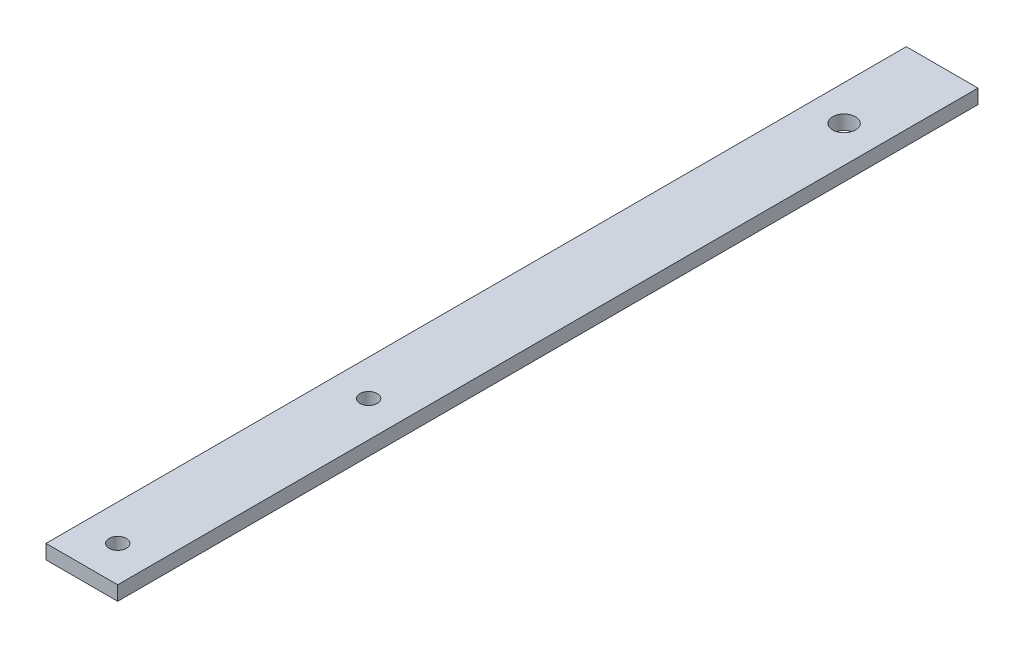
ISO-10303-21;
HEADER;
FILE_DESCRIPTION(('STEP AP214'),'2;1');
FILE_NAME('part.step','',(''),(''),'','','');
FILE_SCHEMA(('AUTOMOTIVE_DESIGN { 1 0 10303 214 1 1 1 1 }'));
ENDSEC;
DATA;
#1=APPLICATION_CONTEXT('core data for automotive mechanical design processes');
#2=APPLICATION_PROTOCOL_DEFINITION('international standard','automotive_design',2000,#1);
#3=PRODUCT_CONTEXT('',#1,'mechanical');
#4=PRODUCT('Part','Part','',(#3));
#5=PRODUCT_RELATED_PRODUCT_CATEGORY('part','',(#4));
#6=PRODUCT_DEFINITION_FORMATION('','',#4);
#7=PRODUCT_DEFINITION_CONTEXT('part definition',#1,'design');
#8=PRODUCT_DEFINITION('design','',#6,#7);
#9=PRODUCT_DEFINITION_SHAPE('','',#8);
#10=(LENGTH_UNIT() NAMED_UNIT(*) SI_UNIT(.MILLI.,.METRE.));
#11=(NAMED_UNIT(*) PLANE_ANGLE_UNIT() SI_UNIT($,.RADIAN.));
#12=(NAMED_UNIT(*) SI_UNIT($,.STERADIAN.) SOLID_ANGLE_UNIT());
#13=UNCERTAINTY_MEASURE_WITH_UNIT(LENGTH_MEASURE(1.E-05),#10,'distance_accuracy_value','');
#14=(GEOMETRIC_REPRESENTATION_CONTEXT(3) GLOBAL_UNCERTAINTY_ASSIGNED_CONTEXT((#13)) GLOBAL_UNIT_ASSIGNED_CONTEXT((#10,
#11,#12)) REPRESENTATION_CONTEXT('',''));
#15=CARTESIAN_POINT('',(0.,0.,0.));
#16=DIRECTION('',(0.,0.,1.));
#17=DIRECTION('',(1.,0.,0.));
#18=AXIS2_PLACEMENT_3D('',#15,#16,#17);
#19=CARTESIAN_POINT('',(0.,5.,0.));
#20=DIRECTION('',(0.,-1.,0.));
#21=DIRECTION('',(0.,0.,-1.));
#22=AXIS2_PLACEMENT_3D('',#19,#20,#21);
#23=PLANE('',#22);
#24=CARTESIAN_POINT('',(12.3,5.,-266.));
#25=DIRECTION('',(0.,1.,0.));
#26=DIRECTION('',(0.,0.,1.));
#27=AXIS2_PLACEMENT_3D('',#24,#25,#26);
#28=CIRCLE('',#27,4.);
#29=CARTESIAN_POINT('',(12.3,5.,-262.));
#30=VERTEX_POINT('',#29);
#31=EDGE_CURVE('E124',#30,#30,#28,.T.);
#32=ORIENTED_EDGE('',*,*,#31,.F.);
#33=EDGE_LOOP('',(#32));
#34=FACE_BOUND('',#33,.T.);
#35=CARTESIAN_POINT('',(12.5,5.,-12.5));
#36=DIRECTION('',(0.,1.,0.));
#37=DIRECTION('',(0.,0.,1.));
#38=AXIS2_PLACEMENT_3D('',#35,#36,#37);
#39=CIRCLE('',#38,3.);
#40=CARTESIAN_POINT('',(12.5,5.,-9.5));
#41=VERTEX_POINT('',#40);
#42=EDGE_CURVE('E100',#41,#41,#39,.T.);
#43=ORIENTED_EDGE('',*,*,#42,.F.);
#44=EDGE_LOOP('',(#43));
#45=FACE_BOUND('',#44,.T.);
#46=DIRECTION('',(0.,0.,1.));
#47=VECTOR('',#46,1.);
#48=CARTESIAN_POINT('',(0.,5.,0.));
#49=LINE('',#48,#47);
#50=CARTESIAN_POINT('',(0.,5.,-300.));
#51=VERTEX_POINT('',#50);
#52=CARTESIAN_POINT('',(0.,5.,0.));
#53=VERTEX_POINT('',#52);
#54=EDGE_CURVE('E85',#51,#53,#49,.T.);
#55=ORIENTED_EDGE('',*,*,#54,.T.);
#56=DIRECTION('',(1.,0.,0.));
#57=VECTOR('',#56,1.);
#58=CARTESIAN_POINT('',(0.,5.,0.));
#59=LINE('',#58,#57);
#60=CARTESIAN_POINT('',(25.,5.,0.));
#61=VERTEX_POINT('',#60);
#62=EDGE_CURVE('E80',#53,#61,#59,.T.);
#63=ORIENTED_EDGE('',*,*,#62,.T.);
#64=DIRECTION('',(0.,0.,-1.));
#65=VECTOR('',#64,1.);
#66=CARTESIAN_POINT('',(25.,5.,0.));
#67=LINE('',#66,#65);
#68=CARTESIAN_POINT('',(25.,5.,-300.));
#69=VERTEX_POINT('',#68);
#70=EDGE_CURVE('E83',#61,#69,#67,.T.);
#71=ORIENTED_EDGE('',*,*,#70,.T.);
#72=DIRECTION('',(-1.,0.,0.));
#73=VECTOR('',#72,1.);
#74=CARTESIAN_POINT('',(0.,5.,-300.));
#75=LINE('',#74,#73);
#76=EDGE_CURVE('E50',#69,#51,#75,.T.);
#77=ORIENTED_EDGE('',*,*,#76,.T.);
#78=EDGE_LOOP('',(#55,#63,#71,#77));
#79=FACE_BOUND('',#78,.T.);
#80=CARTESIAN_POINT('',(12.5,5.,-100.));
#81=DIRECTION('',(0.,1.,0.));
#82=DIRECTION('',(0.,0.,1.));
#83=AXIS2_PLACEMENT_3D('',#80,#81,#82);
#84=CIRCLE('',#83,3.);
#85=CARTESIAN_POINT('',(12.5,5.,-97.));
#86=VERTEX_POINT('',#85);
#87=EDGE_CURVE('E115',#86,#86,#84,.T.);
#88=ORIENTED_EDGE('',*,*,#87,.F.);
#89=EDGE_LOOP('',(#88));
#90=FACE_BOUND('',#89,.T.);
#91=ADVANCED_FACE('F33',(#34,#45,#79,#90),#23,.F.);
#92=CARTESIAN_POINT('',(0.,0.,0.));
#93=DIRECTION('',(0.,-1.,0.));
#94=DIRECTION('',(0.,0.,-1.));
#95=AXIS2_PLACEMENT_3D('',#92,#93,#94);
#96=PLANE('',#95);
#97=CARTESIAN_POINT('',(12.3,0.,-266.));
#98=DIRECTION('',(0.,1.,0.));
#99=DIRECTION('',(0.,0.,1.));
#100=AXIS2_PLACEMENT_3D('',#97,#98,#99);
#101=CIRCLE('',#100,4.);
#102=CARTESIAN_POINT('',(12.3,0.,-262.));
#103=VERTEX_POINT('',#102);
#104=EDGE_CURVE('E121',#103,#103,#101,.T.);
#105=ORIENTED_EDGE('',*,*,#104,.T.);
#106=EDGE_LOOP('',(#105));
#107=FACE_BOUND('',#106,.T.);
#108=CARTESIAN_POINT('',(12.5,0.,-12.5));
#109=DIRECTION('',(0.,1.,0.));
#110=DIRECTION('',(0.,0.,1.));
#111=AXIS2_PLACEMENT_3D('',#108,#109,#110);
#112=CIRCLE('',#111,3.);
#113=CARTESIAN_POINT('',(12.5,0.,-9.5));
#114=VERTEX_POINT('',#113);
#115=EDGE_CURVE('E112',#114,#114,#112,.T.);
#116=ORIENTED_EDGE('',*,*,#115,.T.);
#117=EDGE_LOOP('',(#116));
#118=FACE_BOUND('',#117,.T.);
#119=DIRECTION('',(0.,0.,1.));
#120=VECTOR('',#119,1.);
#121=CARTESIAN_POINT('',(0.,0.,0.));
#122=LINE('',#121,#120);
#123=CARTESIAN_POINT('',(0.,0.,-300.));
#124=VERTEX_POINT('',#123);
#125=CARTESIAN_POINT('',(0.,0.,0.));
#126=VERTEX_POINT('',#125);
#127=EDGE_CURVE('E97',#124,#126,#122,.T.);
#128=ORIENTED_EDGE('',*,*,#127,.F.);
#129=DIRECTION('',(-1.,0.,0.));
#130=VECTOR('',#129,1.);
#131=CARTESIAN_POINT('',(0.,0.,-300.));
#132=LINE('',#131,#130);
#133=CARTESIAN_POINT('',(25.,0.,-300.));
#134=VERTEX_POINT('',#133);
#135=EDGE_CURVE('E73',#134,#124,#132,.T.);
#136=ORIENTED_EDGE('',*,*,#135,.F.);
#137=DIRECTION('',(0.,0.,-1.));
#138=VECTOR('',#137,1.);
#139=CARTESIAN_POINT('',(25.,0.,0.));
#140=LINE('',#139,#138);
#141=CARTESIAN_POINT('',(25.,0.,0.));
#142=VERTEX_POINT('',#141);
#143=EDGE_CURVE('E67',#142,#134,#140,.T.);
#144=ORIENTED_EDGE('',*,*,#143,.F.);
#145=DIRECTION('',(1.,0.,0.));
#146=VECTOR('',#145,1.);
#147=CARTESIAN_POINT('',(0.,0.,0.));
#148=LINE('',#147,#146);
#149=EDGE_CURVE('E89',#126,#142,#148,.T.);
#150=ORIENTED_EDGE('',*,*,#149,.F.);
#151=EDGE_LOOP('',(#128,#136,#144,#150));
#152=FACE_BOUND('',#151,.T.);
#153=CARTESIAN_POINT('',(12.5,0.,-100.));
#154=DIRECTION('',(0.,1.,0.));
#155=DIRECTION('',(0.,0.,1.));
#156=AXIS2_PLACEMENT_3D('',#153,#154,#155);
#157=CIRCLE('',#156,3.);
#158=CARTESIAN_POINT('',(12.5,0.,-97.));
#159=VERTEX_POINT('',#158);
#160=EDGE_CURVE('E118',#159,#159,#157,.T.);
#161=ORIENTED_EDGE('',*,*,#160,.T.);
#162=EDGE_LOOP('',(#161));
#163=FACE_BOUND('',#162,.T.);
#164=ADVANCED_FACE('F108',(#107,#118,#152,#163),#96,.T.);
#165=CARTESIAN_POINT('',(0.,5.,0.));
#166=DIRECTION('',(1.,0.,0.));
#167=DIRECTION('',(0.,0.,-1.));
#168=AXIS2_PLACEMENT_3D('',#165,#166,#167);
#169=PLANE('',#168);
#170=ORIENTED_EDGE('',*,*,#127,.T.);
#171=DIRECTION('',(0.,-1.,0.));
#172=VECTOR('',#171,1.);
#173=CARTESIAN_POINT('',(0.,5.,0.));
#174=LINE('',#173,#172);
#175=EDGE_CURVE('E11',#53,#126,#174,.T.);
#176=ORIENTED_EDGE('',*,*,#175,.F.);
#177=ORIENTED_EDGE('',*,*,#54,.F.);
#178=DIRECTION('',(0.,-1.,0.));
#179=VECTOR('',#178,1.);
#180=CARTESIAN_POINT('',(0.,5.,-300.));
#181=LINE('',#180,#179);
#182=EDGE_CURVE('E93',#51,#124,#181,.T.);
#183=ORIENTED_EDGE('',*,*,#182,.T.);
#184=EDGE_LOOP('',(#170,#176,#177,#183));
#185=FACE_BOUND('',#184,.T.);
#186=ADVANCED_FACE('F35',(#185),#169,.F.);
#187=CARTESIAN_POINT('',(0.,5.,0.));
#188=DIRECTION('',(0.,0.,-1.));
#189=DIRECTION('',(-1.,0.,0.));
#190=AXIS2_PLACEMENT_3D('',#187,#188,#189);
#191=PLANE('',#190);
#192=ORIENTED_EDGE('',*,*,#149,.T.);
#193=DIRECTION('',(0.,-1.,0.));
#194=VECTOR('',#193,1.);
#195=CARTESIAN_POINT('',(25.,5.,0.));
#196=LINE('',#195,#194);
#197=EDGE_CURVE('E42',#61,#142,#196,.T.);
#198=ORIENTED_EDGE('',*,*,#197,.F.);
#199=ORIENTED_EDGE('',*,*,#62,.F.);
#200=ORIENTED_EDGE('',*,*,#175,.T.);
#201=EDGE_LOOP('',(#192,#198,#199,#200));
#202=FACE_BOUND('',#201,.T.);
#203=ADVANCED_FACE('F88',(#202),#191,.F.);
#204=CARTESIAN_POINT('',(25.,5.,0.));
#205=DIRECTION('',(-1.,0.,0.));
#206=DIRECTION('',(0.,0.,1.));
#207=AXIS2_PLACEMENT_3D('',#204,#205,#206);
#208=PLANE('',#207);
#209=ORIENTED_EDGE('',*,*,#143,.T.);
#210=DIRECTION('',(0.,-1.,0.));
#211=VECTOR('',#210,1.);
#212=CARTESIAN_POINT('',(25.,5.,-300.));
#213=LINE('',#212,#211);
#214=EDGE_CURVE('E90',#69,#134,#213,.T.);
#215=ORIENTED_EDGE('',*,*,#214,.F.);
#216=ORIENTED_EDGE('',*,*,#70,.F.);
#217=ORIENTED_EDGE('',*,*,#197,.T.);
#218=EDGE_LOOP('',(#209,#215,#216,#217));
#219=FACE_BOUND('',#218,.T.);
#220=ADVANCED_FACE('F91',(#219),#208,.F.);
#221=CARTESIAN_POINT('',(0.,5.,-300.));
#222=DIRECTION('',(0.,0.,1.));
#223=DIRECTION('',(1.,0.,0.));
#224=AXIS2_PLACEMENT_3D('',#221,#222,#223);
#225=PLANE('',#224);
#226=ORIENTED_EDGE('',*,*,#135,.T.);
#227=ORIENTED_EDGE('',*,*,#182,.F.);
#228=ORIENTED_EDGE('',*,*,#76,.F.);
#229=ORIENTED_EDGE('',*,*,#214,.T.);
#230=EDGE_LOOP('',(#226,#227,#228,#229));
#231=FACE_BOUND('',#230,.T.);
#232=ADVANCED_FACE('F105',(#231),#225,.F.);
#233=CARTESIAN_POINT('',(12.5,5.,-12.5));
#234=DIRECTION('',(0.,-1.,0.));
#235=DIRECTION('',(0.,0.,-1.));
#236=AXIS2_PLACEMENT_3D('',#233,#234,#235);
#237=CYLINDRICAL_SURFACE('',#236,3.);
#238=ORIENTED_EDGE('',*,*,#42,.T.);
#239=EDGE_LOOP('',(#238));
#240=FACE_BOUND('',#239,.T.);
#241=ORIENTED_EDGE('',*,*,#115,.F.);
#242=EDGE_LOOP('',(#241));
#243=FACE_BOUND('',#242,.T.);
#244=ADVANCED_FACE('F144',(#240,#243),#237,.F.);
#245=CARTESIAN_POINT('',(12.5,5.,-100.));
#246=DIRECTION('',(0.,-1.,0.));
#247=DIRECTION('',(0.,0.,-1.));
#248=AXIS2_PLACEMENT_3D('',#245,#246,#247);
#249=CYLINDRICAL_SURFACE('',#248,3.);
#250=ORIENTED_EDGE('',*,*,#87,.T.);
#251=EDGE_LOOP('',(#250));
#252=FACE_BOUND('',#251,.T.);
#253=ORIENTED_EDGE('',*,*,#160,.F.);
#254=EDGE_LOOP('',(#253));
#255=FACE_BOUND('',#254,.T.);
#256=ADVANCED_FACE('F135',(#252,#255),#249,.F.);
#257=CARTESIAN_POINT('',(12.3,0.,-266.));
#258=DIRECTION('',(0.,1.,0.));
#259=DIRECTION('',(0.,0.,1.));
#260=AXIS2_PLACEMENT_3D('',#257,#258,#259);
#261=CYLINDRICAL_SURFACE('',#260,4.);
#262=ORIENTED_EDGE('',*,*,#104,.F.);
#263=EDGE_LOOP('',(#262));
#264=FACE_BOUND('',#263,.T.);
#265=ORIENTED_EDGE('',*,*,#31,.T.);
#266=EDGE_LOOP('',(#265));
#267=FACE_BOUND('',#266,.T.);
#268=ADVANCED_FACE('F132',(#264,#267),#261,.F.);
#269=CLOSED_SHELL('',(#91,#164,#186,#203,#220,#232,#244,#256,#268));
#270=MANIFOLD_SOLID_BREP('B2',#269);
#271=ADVANCED_BREP_SHAPE_REPRESENTATION('',(#18,#270),#14);
#272=SHAPE_DEFINITION_REPRESENTATION(#9,#271);
ENDSEC;
END-ISO-10303-21;
